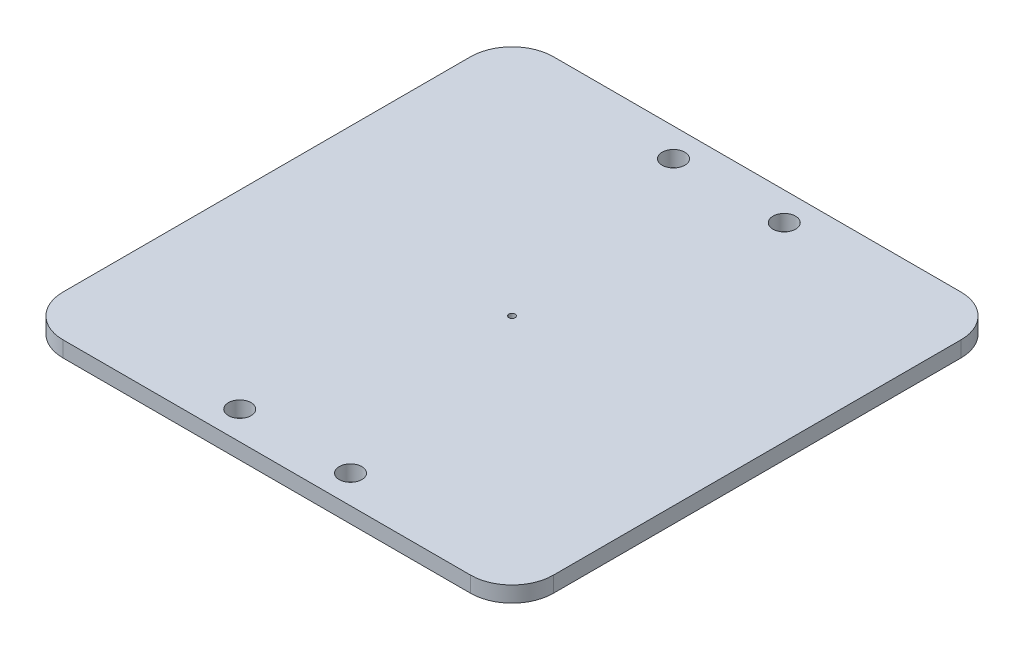
ISO-10303-21;
HEADER;
FILE_DESCRIPTION(('STEP AP214'),'2;1');
FILE_NAME('part.step','',(''),(''),'','','');
FILE_SCHEMA(('AUTOMOTIVE_DESIGN { 1 0 10303 214 1 1 1 1 }'));
ENDSEC;
DATA;
#1=APPLICATION_CONTEXT('core data for automotive mechanical design processes');
#2=APPLICATION_PROTOCOL_DEFINITION('international standard','automotive_design',2000,#1);
#3=PRODUCT_CONTEXT('',#1,'mechanical');
#4=PRODUCT('Part','Part','',(#3));
#5=PRODUCT_RELATED_PRODUCT_CATEGORY('part','',(#4));
#6=PRODUCT_DEFINITION_FORMATION('','',#4);
#7=PRODUCT_DEFINITION_CONTEXT('part definition',#1,'design');
#8=PRODUCT_DEFINITION('design','',#6,#7);
#9=PRODUCT_DEFINITION_SHAPE('','',#8);
#10=(LENGTH_UNIT() NAMED_UNIT(*) SI_UNIT(.MILLI.,.METRE.));
#11=(NAMED_UNIT(*) PLANE_ANGLE_UNIT() SI_UNIT($,.RADIAN.));
#12=(NAMED_UNIT(*) SI_UNIT($,.STERADIAN.) SOLID_ANGLE_UNIT());
#13=UNCERTAINTY_MEASURE_WITH_UNIT(LENGTH_MEASURE(1.E-05),#10,'distance_accuracy_value','');
#14=(GEOMETRIC_REPRESENTATION_CONTEXT(3) GLOBAL_UNCERTAINTY_ASSIGNED_CONTEXT((#13)) GLOBAL_UNIT_ASSIGNED_CONTEXT((#10,
#11,#12)) REPRESENTATION_CONTEXT('',''));
#15=CARTESIAN_POINT('',(0.,0.,0.));
#16=DIRECTION('',(0.,0.,1.));
#17=DIRECTION('',(1.,0.,0.));
#18=AXIS2_PLACEMENT_3D('',#15,#16,#17);
#19=CARTESIAN_POINT('',(22.5425,1.4478,-22.5425));
#20=DIRECTION('',(-1.,0.,0.));
#21=DIRECTION('',(0.,0.,1.));
#22=AXIS2_PLACEMENT_3D('',#19,#20,#21);
#23=PLANE('',#22);
#24=DIRECTION('',(0.,0.,-1.));
#25=VECTOR('',#24,1.);
#26=CARTESIAN_POINT('',(22.5425,0.,-22.5425));
#27=LINE('',#26,#25);
#28=CARTESIAN_POINT('',(22.5425,0.,18.7325));
#29=VERTEX_POINT('',#28);
#30=CARTESIAN_POINT('',(22.5425,0.,-18.7325));
#31=VERTEX_POINT('',#30);
#32=EDGE_CURVE('E130',#29,#31,#27,.T.);
#33=ORIENTED_EDGE('',*,*,#32,.T.);
#34=DIRECTION('',(0.,-1.,0.));
#35=VECTOR('',#34,1.);
#36=CARTESIAN_POINT('',(22.5425,1.4478,-18.7325));
#37=LINE('',#36,#35);
#38=CARTESIAN_POINT('',(22.5425,1.4478,-18.7325));
#39=VERTEX_POINT('',#38);
#40=EDGE_CURVE('E169',#31,#39,#37,.F.);
#41=ORIENTED_EDGE('',*,*,#40,.T.);
#42=DIRECTION('',(0.,0.,-1.));
#43=VECTOR('',#42,1.);
#44=CARTESIAN_POINT('',(22.5425,1.4478,-22.5425));
#45=LINE('',#44,#43);
#46=CARTESIAN_POINT('',(22.5425,1.4478,18.7325));
#47=VERTEX_POINT('',#46);
#48=EDGE_CURVE('E128',#47,#39,#45,.T.);
#49=ORIENTED_EDGE('',*,*,#48,.F.);
#50=DIRECTION('',(0.,-1.,0.));
#51=VECTOR('',#50,1.);
#52=CARTESIAN_POINT('',(22.5425,1.4478,18.7325));
#53=LINE('',#52,#51);
#54=EDGE_CURVE('E166',#47,#29,#53,.T.);
#55=ORIENTED_EDGE('',*,*,#54,.T.);
#56=EDGE_LOOP('',(#33,#41,#49,#55));
#57=FACE_BOUND('',#56,.T.);
#58=ADVANCED_FACE('F35',(#57),#23,.F.);
#59=CARTESIAN_POINT('',(-22.5425,1.4478,-22.5425));
#60=DIRECTION('',(0.,0.,1.));
#61=DIRECTION('',(1.,0.,0.));
#62=AXIS2_PLACEMENT_3D('',#59,#60,#61);
#63=PLANE('',#62);
#64=DIRECTION('',(-1.,0.,0.));
#65=VECTOR('',#64,1.);
#66=CARTESIAN_POINT('',(-22.5425,0.,-22.5425));
#67=LINE('',#66,#65);
#68=CARTESIAN_POINT('',(18.7325,0.,-22.5425));
#69=VERTEX_POINT('',#68);
#70=CARTESIAN_POINT('',(-18.7325,0.,-22.5425));
#71=VERTEX_POINT('',#70);
#72=EDGE_CURVE('E126',#69,#71,#67,.T.);
#73=ORIENTED_EDGE('',*,*,#72,.T.);
#74=DIRECTION('',(0.,-1.,0.));
#75=VECTOR('',#74,1.);
#76=CARTESIAN_POINT('',(-18.7325,1.4478,-22.5425));
#77=LINE('',#76,#75);
#78=CARTESIAN_POINT('',(-18.7325,1.4478,-22.5425));
#79=VERTEX_POINT('',#78);
#80=EDGE_CURVE('E105',#71,#79,#77,.F.);
#81=ORIENTED_EDGE('',*,*,#80,.T.);
#82=DIRECTION('',(-1.,0.,0.));
#83=VECTOR('',#82,1.);
#84=CARTESIAN_POINT('',(-22.5425,1.4478,-22.5425));
#85=LINE('',#84,#83);
#86=CARTESIAN_POINT('',(18.7325,1.4478,-22.5425));
#87=VERTEX_POINT('',#86);
#88=EDGE_CURVE('E185',#87,#79,#85,.T.);
#89=ORIENTED_EDGE('',*,*,#88,.F.);
#90=DIRECTION('',(0.,-1.,0.));
#91=VECTOR('',#90,1.);
#92=CARTESIAN_POINT('',(18.7325,1.4478,-22.5425));
#93=LINE('',#92,#91);
#94=EDGE_CURVE('E110',#87,#69,#93,.T.);
#95=ORIENTED_EDGE('',*,*,#94,.T.);
#96=EDGE_LOOP('',(#73,#81,#89,#95));
#97=FACE_BOUND('',#96,.T.);
#98=ADVANCED_FACE('F210',(#97),#63,.F.);
#99=CARTESIAN_POINT('',(-22.5425,1.4478,-22.5425));
#100=DIRECTION('',(1.,0.,0.));
#101=DIRECTION('',(0.,0.,-1.));
#102=AXIS2_PLACEMENT_3D('',#99,#100,#101);
#103=PLANE('',#102);
#104=DIRECTION('',(0.,0.,1.));
#105=VECTOR('',#104,1.);
#106=CARTESIAN_POINT('',(-22.5425,1.4478,-22.5425));
#107=LINE('',#106,#105);
#108=CARTESIAN_POINT('',(-22.5425,1.4478,-18.7325));
#109=VERTEX_POINT('',#108);
#110=CARTESIAN_POINT('',(-22.5425,1.4478,18.7325));
#111=VERTEX_POINT('',#110);
#112=EDGE_CURVE('E119',#109,#111,#107,.T.);
#113=ORIENTED_EDGE('',*,*,#112,.F.);
#114=DIRECTION('',(0.,-1.,0.));
#115=VECTOR('',#114,1.);
#116=CARTESIAN_POINT('',(-22.5425,1.4478,-18.7325));
#117=LINE('',#116,#115);
#118=CARTESIAN_POINT('',(-22.5425,0.,-18.7325));
#119=VERTEX_POINT('',#118);
#120=EDGE_CURVE('E104',#109,#119,#117,.T.);
#121=ORIENTED_EDGE('',*,*,#120,.T.);
#122=DIRECTION('',(0.,0.,1.));
#123=VECTOR('',#122,1.);
#124=CARTESIAN_POINT('',(-22.5425,0.,-22.5425));
#125=LINE('',#124,#123);
#126=CARTESIAN_POINT('',(-22.5425,0.,18.7325));
#127=VERTEX_POINT('',#126);
#128=EDGE_CURVE('E117',#119,#127,#125,.T.);
#129=ORIENTED_EDGE('',*,*,#128,.T.);
#130=DIRECTION('',(0.,-1.,0.));
#131=VECTOR('',#130,1.);
#132=CARTESIAN_POINT('',(-22.5425,1.4478,18.7325));
#133=LINE('',#132,#131);
#134=EDGE_CURVE('E121',#127,#111,#133,.F.);
#135=ORIENTED_EDGE('',*,*,#134,.T.);
#136=EDGE_LOOP('',(#113,#121,#129,#135));
#137=FACE_BOUND('',#136,.T.);
#138=ADVANCED_FACE('F116',(#137),#103,.F.);
#139=CARTESIAN_POINT('',(-22.5425,1.4478,22.5425));
#140=DIRECTION('',(0.,0.,-1.));
#141=DIRECTION('',(-1.,0.,0.));
#142=AXIS2_PLACEMENT_3D('',#139,#140,#141);
#143=PLANE('',#142);
#144=DIRECTION('',(1.,0.,0.));
#145=VECTOR('',#144,1.);
#146=CARTESIAN_POINT('',(-22.5425,0.,22.5425));
#147=LINE('',#146,#145);
#148=CARTESIAN_POINT('',(-18.7325,0.,22.5425));
#149=VERTEX_POINT('',#148);
#150=CARTESIAN_POINT('',(18.7325,0.,22.5425));
#151=VERTEX_POINT('',#150);
#152=EDGE_CURVE('E125',#149,#151,#147,.T.);
#153=ORIENTED_EDGE('',*,*,#152,.T.);
#154=DIRECTION('',(0.,-1.,0.));
#155=VECTOR('',#154,1.);
#156=CARTESIAN_POINT('',(18.7325,1.4478,22.5425));
#157=LINE('',#156,#155);
#158=CARTESIAN_POINT('',(18.7325,1.4478,22.5425));
#159=VERTEX_POINT('',#158);
#160=EDGE_CURVE('E11',#151,#159,#157,.F.);
#161=ORIENTED_EDGE('',*,*,#160,.T.);
#162=DIRECTION('',(1.,0.,0.));
#163=VECTOR('',#162,1.);
#164=CARTESIAN_POINT('',(-22.5425,1.4478,22.5425));
#165=LINE('',#164,#163);
#166=CARTESIAN_POINT('',(-18.7325,1.4478,22.5425));
#167=VERTEX_POINT('',#166);
#168=EDGE_CURVE('E150',#167,#159,#165,.T.);
#169=ORIENTED_EDGE('',*,*,#168,.F.);
#170=DIRECTION('',(0.,-1.,0.));
#171=VECTOR('',#170,1.);
#172=CARTESIAN_POINT('',(-18.7325,1.4478,22.5425));
#173=LINE('',#172,#171);
#174=EDGE_CURVE('E43',#167,#149,#173,.T.);
#175=ORIENTED_EDGE('',*,*,#174,.T.);
#176=EDGE_LOOP('',(#153,#161,#169,#175));
#177=FACE_BOUND('',#176,.T.);
#178=ADVANCED_FACE('F172',(#177),#143,.F.);
#179=CARTESIAN_POINT('',(0.,1.4478,0.));
#180=DIRECTION('',(0.,1.,0.));
#181=DIRECTION('',(0.,0.,1.));
#182=AXIS2_PLACEMENT_3D('',#179,#180,#181);
#183=PLANE('',#182);
#184=CARTESIAN_POINT('',(-5.0927,1.4478,19.939));
#185=DIRECTION('',(0.,1.,0.));
#186=DIRECTION('',(0.,0.,1.));
#187=AXIS2_PLACEMENT_3D('',#184,#185,#186);
#188=CIRCLE('',#187,1.0414);
#189=CARTESIAN_POINT('',(-5.0927,1.4478,20.9804));
#190=VERTEX_POINT('',#189);
#191=EDGE_CURVE('E347',#190,#190,#188,.T.);
#192=ORIENTED_EDGE('',*,*,#191,.F.);
#193=EDGE_LOOP('',(#192));
#194=FACE_BOUND('',#193,.T.);
#195=CARTESIAN_POINT('',(5.0927,1.4478,19.939));
#196=DIRECTION('',(0.,1.,0.));
#197=DIRECTION('',(0.,0.,1.));
#198=AXIS2_PLACEMENT_3D('',#195,#196,#197);
#199=CIRCLE('',#198,1.0414);
#200=CARTESIAN_POINT('',(5.0927,1.4478,20.9804));
#201=VERTEX_POINT('',#200);
#202=EDGE_CURVE('E343',#201,#201,#199,.T.);
#203=ORIENTED_EDGE('',*,*,#202,.F.);
#204=EDGE_LOOP('',(#203));
#205=FACE_BOUND('',#204,.T.);
#206=CARTESIAN_POINT('',(5.0927,1.4478,-19.939));
#207=DIRECTION('',(0.,1.,0.));
#208=DIRECTION('',(0.,0.,1.));
#209=AXIS2_PLACEMENT_3D('',#206,#207,#208);
#210=CIRCLE('',#209,1.0414);
#211=CARTESIAN_POINT('',(5.0927,1.4478,-18.8976));
#212=VERTEX_POINT('',#211);
#213=EDGE_CURVE('E339',#212,#212,#210,.T.);
#214=ORIENTED_EDGE('',*,*,#213,.F.);
#215=EDGE_LOOP('',(#214));
#216=FACE_BOUND('',#215,.T.);
#217=CARTESIAN_POINT('',(-5.0927,1.4478,-19.939));
#218=DIRECTION('',(0.,1.,0.));
#219=DIRECTION('',(0.,0.,1.));
#220=AXIS2_PLACEMENT_3D('',#217,#218,#219);
#221=CIRCLE('',#220,1.0414);
#222=CARTESIAN_POINT('',(-5.0927,1.4478,-18.8976));
#223=VERTEX_POINT('',#222);
#224=EDGE_CURVE('E337',#223,#223,#221,.T.);
#225=ORIENTED_EDGE('',*,*,#224,.F.);
#226=EDGE_LOOP('',(#225));
#227=FACE_BOUND('',#226,.T.);
#228=CARTESIAN_POINT('',(0.,1.4478,0.));
#229=DIRECTION('',(0.,1.,0.));
#230=DIRECTION('',(0.,0.,1.));
#231=AXIS2_PLACEMENT_3D('',#228,#229,#230);
#232=CIRCLE('',#231,0.290766207037038);
#233=CARTESIAN_POINT('',(0.,1.4478,0.290766207037038));
#234=VERTEX_POINT('',#233);
#235=EDGE_CURVE('E138',#234,#234,#232,.T.);
#236=ORIENTED_EDGE('',*,*,#235,.F.);
#237=EDGE_LOOP('',(#236));
#238=FACE_BOUND('',#237,.T.);
#239=ORIENTED_EDGE('',*,*,#88,.T.);
#240=CARTESIAN_POINT('',(-18.7325,1.4478,-18.7325));
#241=DIRECTION('',(0.,1.,0.));
#242=DIRECTION('',(0.,0.,1.));
#243=AXIS2_PLACEMENT_3D('',#240,#241,#242);
#244=CIRCLE('',#243,3.81);
#245=EDGE_CURVE('E164',#79,#109,#244,.T.);
#246=ORIENTED_EDGE('',*,*,#245,.T.);
#247=ORIENTED_EDGE('',*,*,#112,.T.);
#248=CARTESIAN_POINT('',(-18.7325,1.4478,18.7325));
#249=DIRECTION('',(0.,1.,0.));
#250=DIRECTION('',(0.,0.,1.));
#251=AXIS2_PLACEMENT_3D('',#248,#249,#250);
#252=CIRCLE('',#251,3.81);
#253=EDGE_CURVE('E55',#111,#167,#252,.T.);
#254=ORIENTED_EDGE('',*,*,#253,.T.);
#255=ORIENTED_EDGE('',*,*,#168,.T.);
#256=CARTESIAN_POINT('',(18.7325,1.4478,18.7325));
#257=DIRECTION('',(0.,1.,0.));
#258=DIRECTION('',(0.,0.,1.));
#259=AXIS2_PLACEMENT_3D('',#256,#257,#258);
#260=CIRCLE('',#259,3.81);
#261=EDGE_CURVE('E160',#159,#47,#260,.T.);
#262=ORIENTED_EDGE('',*,*,#261,.T.);
#263=ORIENTED_EDGE('',*,*,#48,.T.);
#264=CARTESIAN_POINT('',(18.7325,1.4478,-18.7325));
#265=DIRECTION('',(0.,1.,0.));
#266=DIRECTION('',(0.,0.,1.));
#267=AXIS2_PLACEMENT_3D('',#264,#265,#266);
#268=CIRCLE('',#267,3.81);
#269=EDGE_CURVE('E162',#39,#87,#268,.T.);
#270=ORIENTED_EDGE('',*,*,#269,.T.);
#271=EDGE_LOOP('',(#239,#246,#247,#254,#255,#262,#263,#270));
#272=FACE_BOUND('',#271,.T.);
#273=ADVANCED_FACE('F193',(#194,#205,#216,#227,#238,#272),#183,.T.);
#274=CARTESIAN_POINT('',(0.,0.,0.));
#275=DIRECTION('',(0.,1.,0.));
#276=DIRECTION('',(0.,0.,1.));
#277=AXIS2_PLACEMENT_3D('',#274,#275,#276);
#278=PLANE('',#277);
#279=CARTESIAN_POINT('',(-5.0927,0.,19.939));
#280=DIRECTION('',(0.,1.,0.));
#281=DIRECTION('',(0.,0.,1.));
#282=AXIS2_PLACEMENT_3D('',#279,#280,#281);
#283=CIRCLE('',#282,1.0414);
#284=CARTESIAN_POINT('',(-5.0927,0.,20.9804));
#285=VERTEX_POINT('',#284);
#286=EDGE_CURVE('E147',#285,#285,#283,.T.);
#287=ORIENTED_EDGE('',*,*,#286,.T.);
#288=EDGE_LOOP('',(#287));
#289=FACE_BOUND('',#288,.T.);
#290=CARTESIAN_POINT('',(5.0927,0.,19.939));
#291=DIRECTION('',(0.,1.,0.));
#292=DIRECTION('',(0.,0.,1.));
#293=AXIS2_PLACEMENT_3D('',#290,#291,#292);
#294=CIRCLE('',#293,1.0414);
#295=CARTESIAN_POINT('',(5.0927,0.,20.9804));
#296=VERTEX_POINT('',#295);
#297=EDGE_CURVE('E144',#296,#296,#294,.T.);
#298=ORIENTED_EDGE('',*,*,#297,.T.);
#299=EDGE_LOOP('',(#298));
#300=FACE_BOUND('',#299,.T.);
#301=CARTESIAN_POINT('',(5.0927,0.,-19.939));
#302=DIRECTION('',(0.,1.,0.));
#303=DIRECTION('',(0.,0.,1.));
#304=AXIS2_PLACEMENT_3D('',#301,#302,#303);
#305=CIRCLE('',#304,1.0414);
#306=CARTESIAN_POINT('',(5.0927,0.,-18.8976));
#307=VERTEX_POINT('',#306);
#308=EDGE_CURVE('E141',#307,#307,#305,.T.);
#309=ORIENTED_EDGE('',*,*,#308,.T.);
#310=EDGE_LOOP('',(#309));
#311=FACE_BOUND('',#310,.T.);
#312=CARTESIAN_POINT('',(-5.0927,0.,-19.939));
#313=DIRECTION('',(0.,1.,0.));
#314=DIRECTION('',(0.,0.,1.));
#315=AXIS2_PLACEMENT_3D('',#312,#313,#314);
#316=CIRCLE('',#315,1.0414);
#317=CARTESIAN_POINT('',(-5.0927,0.,-18.8976));
#318=VERTEX_POINT('',#317);
#319=EDGE_CURVE('E137',#318,#318,#316,.T.);
#320=ORIENTED_EDGE('',*,*,#319,.T.);
#321=EDGE_LOOP('',(#320));
#322=FACE_BOUND('',#321,.T.);
#323=CARTESIAN_POINT('',(0.,0.,0.));
#324=DIRECTION('',(0.,1.,0.));
#325=DIRECTION('',(0.,0.,1.));
#326=AXIS2_PLACEMENT_3D('',#323,#324,#325);
#327=CIRCLE('',#326,0.290766207037038);
#328=CARTESIAN_POINT('',(0.,0.,0.290766207037038));
#329=VERTEX_POINT('',#328);
#330=EDGE_CURVE('E134',#329,#329,#327,.T.);
#331=ORIENTED_EDGE('',*,*,#330,.T.);
#332=EDGE_LOOP('',(#331));
#333=FACE_BOUND('',#332,.T.);
#334=ORIENTED_EDGE('',*,*,#128,.F.);
#335=CARTESIAN_POINT('',(-18.7325,0.,-18.7325));
#336=DIRECTION('',(0.,1.,0.));
#337=DIRECTION('',(0.,0.,1.));
#338=AXIS2_PLACEMENT_3D('',#335,#336,#337);
#339=CIRCLE('',#338,3.81);
#340=EDGE_CURVE('E100',#119,#71,#339,.F.);
#341=ORIENTED_EDGE('',*,*,#340,.T.);
#342=ORIENTED_EDGE('',*,*,#72,.F.);
#343=CARTESIAN_POINT('',(18.7325,0.,-18.7325));
#344=DIRECTION('',(0.,1.,0.));
#345=DIRECTION('',(0.,0.,1.));
#346=AXIS2_PLACEMENT_3D('',#343,#344,#345);
#347=CIRCLE('',#346,3.81);
#348=EDGE_CURVE('E111',#69,#31,#347,.F.);
#349=ORIENTED_EDGE('',*,*,#348,.T.);
#350=ORIENTED_EDGE('',*,*,#32,.F.);
#351=CARTESIAN_POINT('',(18.7325,0.,18.7325));
#352=DIRECTION('',(0.,1.,0.));
#353=DIRECTION('',(0.,0.,1.));
#354=AXIS2_PLACEMENT_3D('',#351,#352,#353);
#355=CIRCLE('',#354,3.81);
#356=EDGE_CURVE('E153',#29,#151,#355,.F.);
#357=ORIENTED_EDGE('',*,*,#356,.T.);
#358=ORIENTED_EDGE('',*,*,#152,.F.);
#359=CARTESIAN_POINT('',(-18.7325,0.,18.7325));
#360=DIRECTION('',(0.,1.,0.));
#361=DIRECTION('',(0.,0.,1.));
#362=AXIS2_PLACEMENT_3D('',#359,#360,#361);
#363=CIRCLE('',#362,3.81);
#364=EDGE_CURVE('E120',#149,#127,#363,.F.);
#365=ORIENTED_EDGE('',*,*,#364,.T.);
#366=EDGE_LOOP('',(#334,#341,#342,#349,#350,#357,#358,#365));
#367=FACE_BOUND('',#366,.T.);
#368=ADVANCED_FACE('F123',(#289,#300,#311,#322,#333,#367),#278,.F.);
#369=CARTESIAN_POINT('',(0.,-2.0922,0.));
#370=DIRECTION('',(0.,1.,0.));
#371=DIRECTION('',(0.,0.,1.));
#372=AXIS2_PLACEMENT_3D('',#369,#370,#371);
#373=CYLINDRICAL_SURFACE('',#372,0.290766207037038);
#374=ORIENTED_EDGE('',*,*,#235,.T.);
#375=EDGE_LOOP('',(#374));
#376=FACE_BOUND('',#375,.T.);
#377=ORIENTED_EDGE('',*,*,#330,.F.);
#378=EDGE_LOOP('',(#377));
#379=FACE_BOUND('',#378,.T.);
#380=ADVANCED_FACE('F202',(#376,#379),#373,.F.);
#381=CARTESIAN_POINT('',(-5.0927,-2.0922,-19.939));
#382=DIRECTION('',(0.,1.,0.));
#383=DIRECTION('',(0.,0.,1.));
#384=AXIS2_PLACEMENT_3D('',#381,#382,#383);
#385=CYLINDRICAL_SURFACE('',#384,1.0414);
#386=ORIENTED_EDGE('',*,*,#224,.T.);
#387=EDGE_LOOP('',(#386));
#388=FACE_BOUND('',#387,.T.);
#389=ORIENTED_EDGE('',*,*,#319,.F.);
#390=EDGE_LOOP('',(#389));
#391=FACE_BOUND('',#390,.T.);
#392=ADVANCED_FACE('F311',(#388,#391),#385,.F.);
#393=CARTESIAN_POINT('',(5.0927,-2.0922,-19.939));
#394=DIRECTION('',(0.,1.,0.));
#395=DIRECTION('',(0.,0.,1.));
#396=AXIS2_PLACEMENT_3D('',#393,#394,#395);
#397=CYLINDRICAL_SURFACE('',#396,1.0414);
#398=ORIENTED_EDGE('',*,*,#213,.T.);
#399=EDGE_LOOP('',(#398));
#400=FACE_BOUND('',#399,.T.);
#401=ORIENTED_EDGE('',*,*,#308,.F.);
#402=EDGE_LOOP('',(#401));
#403=FACE_BOUND('',#402,.T.);
#404=ADVANCED_FACE('F301',(#400,#403),#397,.F.);
#405=CARTESIAN_POINT('',(5.0927,-2.0922,19.939));
#406=DIRECTION('',(0.,1.,0.));
#407=DIRECTION('',(0.,0.,1.));
#408=AXIS2_PLACEMENT_3D('',#405,#406,#407);
#409=CYLINDRICAL_SURFACE('',#408,1.0414);
#410=ORIENTED_EDGE('',*,*,#202,.T.);
#411=EDGE_LOOP('',(#410));
#412=FACE_BOUND('',#411,.T.);
#413=ORIENTED_EDGE('',*,*,#297,.F.);
#414=EDGE_LOOP('',(#413));
#415=FACE_BOUND('',#414,.T.);
#416=ADVANCED_FACE('F291',(#412,#415),#409,.F.);
#417=CARTESIAN_POINT('',(-5.0927,-2.0922,19.939));
#418=DIRECTION('',(0.,1.,0.));
#419=DIRECTION('',(0.,0.,1.));
#420=AXIS2_PLACEMENT_3D('',#417,#418,#419);
#421=CYLINDRICAL_SURFACE('',#420,1.0414);
#422=ORIENTED_EDGE('',*,*,#191,.T.);
#423=EDGE_LOOP('',(#422));
#424=FACE_BOUND('',#423,.T.);
#425=ORIENTED_EDGE('',*,*,#286,.F.);
#426=EDGE_LOOP('',(#425));
#427=FACE_BOUND('',#426,.T.);
#428=ADVANCED_FACE('F222',(#424,#427),#421,.F.);
#429=CARTESIAN_POINT('',(-18.7325,1.4478,-18.7325));
#430=DIRECTION('',(0.,-1.,0.));
#431=DIRECTION('',(0.,0.,-1.));
#432=AXIS2_PLACEMENT_3D('',#429,#430,#431);
#433=CYLINDRICAL_SURFACE('',#432,3.81);
#434=ORIENTED_EDGE('',*,*,#245,.F.);
#435=ORIENTED_EDGE('',*,*,#80,.F.);
#436=ORIENTED_EDGE('',*,*,#340,.F.);
#437=ORIENTED_EDGE('',*,*,#120,.F.);
#438=EDGE_LOOP('',(#434,#435,#436,#437));
#439=FACE_BOUND('',#438,.T.);
#440=ADVANCED_FACE('F103',(#439),#433,.T.);
#441=CARTESIAN_POINT('',(18.7325,1.4478,-18.7325));
#442=DIRECTION('',(0.,-1.,0.));
#443=DIRECTION('',(0.,0.,-1.));
#444=AXIS2_PLACEMENT_3D('',#441,#442,#443);
#445=CYLINDRICAL_SURFACE('',#444,3.81);
#446=ORIENTED_EDGE('',*,*,#269,.F.);
#447=ORIENTED_EDGE('',*,*,#40,.F.);
#448=ORIENTED_EDGE('',*,*,#348,.F.);
#449=ORIENTED_EDGE('',*,*,#94,.F.);
#450=EDGE_LOOP('',(#446,#447,#448,#449));
#451=FACE_BOUND('',#450,.T.);
#452=ADVANCED_FACE('F221',(#451),#445,.T.);
#453=CARTESIAN_POINT('',(18.7325,1.4478,18.7325));
#454=DIRECTION('',(0.,-1.,0.));
#455=DIRECTION('',(0.,0.,-1.));
#456=AXIS2_PLACEMENT_3D('',#453,#454,#455);
#457=CYLINDRICAL_SURFACE('',#456,3.81);
#458=ORIENTED_EDGE('',*,*,#261,.F.);
#459=ORIENTED_EDGE('',*,*,#160,.F.);
#460=ORIENTED_EDGE('',*,*,#356,.F.);
#461=ORIENTED_EDGE('',*,*,#54,.F.);
#462=EDGE_LOOP('',(#458,#459,#460,#461));
#463=FACE_BOUND('',#462,.T.);
#464=ADVANCED_FACE('F179',(#463),#457,.T.);
#465=CARTESIAN_POINT('',(-18.7325,1.4478,18.7325));
#466=DIRECTION('',(0.,-1.,0.));
#467=DIRECTION('',(0.,0.,-1.));
#468=AXIS2_PLACEMENT_3D('',#465,#466,#467);
#469=CYLINDRICAL_SURFACE('',#468,3.81);
#470=ORIENTED_EDGE('',*,*,#253,.F.);
#471=ORIENTED_EDGE('',*,*,#134,.F.);
#472=ORIENTED_EDGE('',*,*,#364,.F.);
#473=ORIENTED_EDGE('',*,*,#174,.F.);
#474=EDGE_LOOP('',(#470,#471,#472,#473));
#475=FACE_BOUND('',#474,.T.);
#476=ADVANCED_FACE('F37',(#475),#469,.T.);
#477=CLOSED_SHELL('',(#58,#98,#138,#178,#273,#368,#380,#392,#404,#416,#428,#440,#452,#464,#476));
#478=MANIFOLD_SOLID_BREP('B2',#477);
#479=ADVANCED_BREP_SHAPE_REPRESENTATION('',(#18,#478),#14);
#480=SHAPE_DEFINITION_REPRESENTATION(#9,#479);
ENDSEC;
END-ISO-10303-21;
